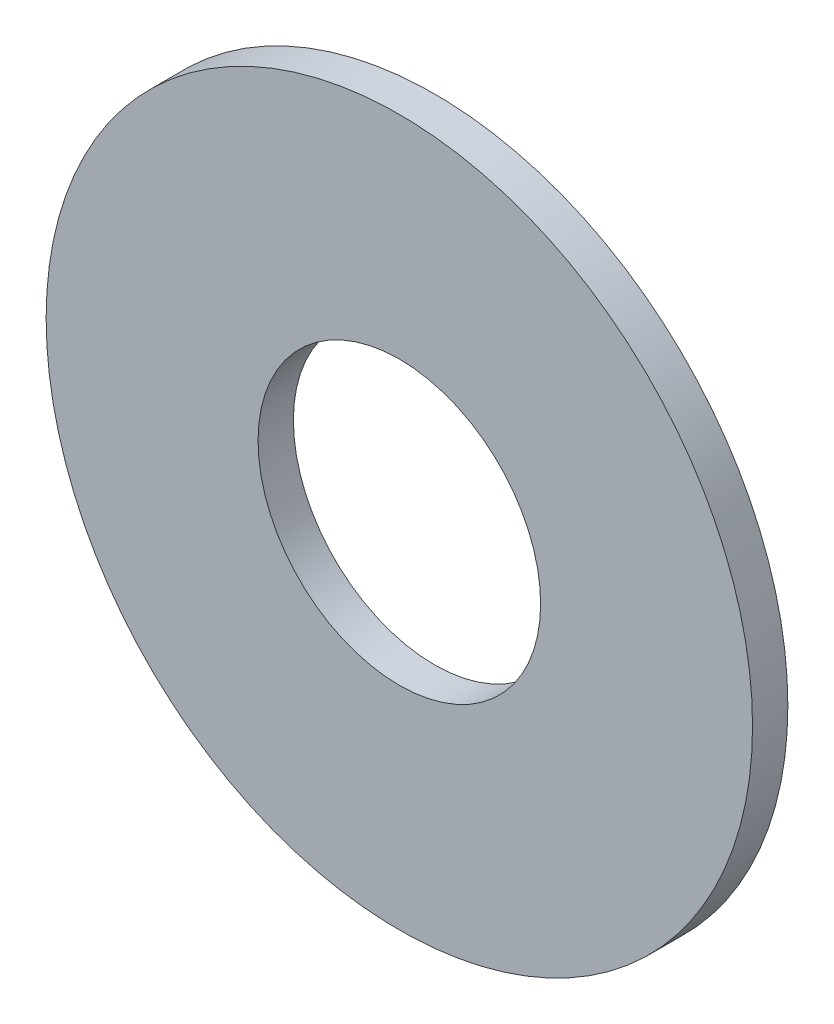
ISO-10303-21;
HEADER;
FILE_DESCRIPTION(('STEP AP214'),'2;1');
FILE_NAME('part.step','',(''),(''),'','','');
FILE_SCHEMA(('AUTOMOTIVE_DESIGN { 1 0 10303 214 1 1 1 1 }'));
ENDSEC;
DATA;
#1=APPLICATION_CONTEXT('core data for automotive mechanical design processes');
#2=APPLICATION_PROTOCOL_DEFINITION('international standard','automotive_design',2000,#1);
#3=PRODUCT_CONTEXT('',#1,'mechanical');
#4=PRODUCT('Part','Part','',(#3));
#5=PRODUCT_RELATED_PRODUCT_CATEGORY('part','',(#4));
#6=PRODUCT_DEFINITION_FORMATION('','',#4);
#7=PRODUCT_DEFINITION_CONTEXT('part definition',#1,'design');
#8=PRODUCT_DEFINITION('design','',#6,#7);
#9=PRODUCT_DEFINITION_SHAPE('','',#8);
#10=(LENGTH_UNIT() NAMED_UNIT(*) SI_UNIT(.MILLI.,.METRE.));
#11=(NAMED_UNIT(*) PLANE_ANGLE_UNIT() SI_UNIT($,.RADIAN.));
#12=(NAMED_UNIT(*) SI_UNIT($,.STERADIAN.) SOLID_ANGLE_UNIT());
#13=UNCERTAINTY_MEASURE_WITH_UNIT(LENGTH_MEASURE(1.E-05),#10,'distance_accuracy_value','');
#14=(GEOMETRIC_REPRESENTATION_CONTEXT(3) GLOBAL_UNCERTAINTY_ASSIGNED_CONTEXT((#13)) GLOBAL_UNIT_ASSIGNED_CONTEXT((#10,
#11,#12)) REPRESENTATION_CONTEXT('',''));
#15=CARTESIAN_POINT('',(0.,0.,0.));
#16=DIRECTION('',(0.,0.,1.));
#17=DIRECTION('',(1.,0.,0.));
#18=AXIS2_PLACEMENT_3D('',#15,#16,#17);
#19=CARTESIAN_POINT('',(0.,0.,0.5));
#20=DIRECTION('',(0.,0.,1.));
#21=DIRECTION('',(1.,0.,0.));
#22=AXIS2_PLACEMENT_3D('',#19,#20,#21);
#23=PLANE('',#22);
#24=CARTESIAN_POINT('',(0.,0.,0.5));
#25=DIRECTION('',(0.,0.,1.));
#26=DIRECTION('',(1.,0.,0.));
#27=AXIS2_PLACEMENT_3D('',#24,#25,#26);
#28=CIRCLE('',#27,5.);
#29=CARTESIAN_POINT('',(5.,0.,0.5));
#30=VERTEX_POINT('',#29);
#31=EDGE_CURVE('E10',#30,#30,#28,.T.);
#32=ORIENTED_EDGE('',*,*,#31,.T.);
#33=EDGE_LOOP('',(#32));
#34=FACE_BOUND('',#33,.T.);
#35=CARTESIAN_POINT('',(0.,0.,0.5));
#36=DIRECTION('',(0.,0.,1.));
#37=DIRECTION('',(1.,0.,0.));
#38=AXIS2_PLACEMENT_3D('',#35,#36,#37);
#39=CIRCLE('',#38,2.);
#40=CARTESIAN_POINT('',(2.,0.,0.5));
#41=VERTEX_POINT('',#40);
#42=EDGE_CURVE('E50',#41,#41,#39,.T.);
#43=ORIENTED_EDGE('',*,*,#42,.F.);
#44=EDGE_LOOP('',(#43));
#45=FACE_BOUND('',#44,.T.);
#46=ADVANCED_FACE('F39',(#34,#45),#23,.T.);
#47=CARTESIAN_POINT('',(0.,0.,0.));
#48=DIRECTION('',(0.,0.,1.));
#49=DIRECTION('',(1.,0.,0.));
#50=AXIS2_PLACEMENT_3D('',#47,#48,#49);
#51=PLANE('',#50);
#52=CARTESIAN_POINT('',(0.,0.,0.));
#53=DIRECTION('',(0.,0.,1.));
#54=DIRECTION('',(1.,0.,0.));
#55=AXIS2_PLACEMENT_3D('',#52,#53,#54);
#56=CIRCLE('',#55,5.);
#57=CARTESIAN_POINT('',(5.,0.,0.));
#58=VERTEX_POINT('',#57);
#59=EDGE_CURVE('E43',#58,#58,#56,.T.);
#60=ORIENTED_EDGE('',*,*,#59,.F.);
#61=EDGE_LOOP('',(#60));
#62=FACE_BOUND('',#61,.T.);
#63=CARTESIAN_POINT('',(0.,0.,0.));
#64=DIRECTION('',(0.,0.,1.));
#65=DIRECTION('',(1.,0.,0.));
#66=AXIS2_PLACEMENT_3D('',#63,#64,#65);
#67=CIRCLE('',#66,2.);
#68=CARTESIAN_POINT('',(2.,0.,0.));
#69=VERTEX_POINT('',#68);
#70=EDGE_CURVE('E52',#69,#69,#67,.T.);
#71=ORIENTED_EDGE('',*,*,#70,.T.);
#72=EDGE_LOOP('',(#71));
#73=FACE_BOUND('',#72,.T.);
#74=ADVANCED_FACE('F62',(#62,#73),#51,.F.);
#75=CARTESIAN_POINT('',(0.,0.,0.5));
#76=DIRECTION('',(0.,0.,-1.));
#77=DIRECTION('',(-1.,0.,0.));
#78=AXIS2_PLACEMENT_3D('',#75,#76,#77);
#79=CYLINDRICAL_SURFACE('',#78,5.);
#80=ORIENTED_EDGE('',*,*,#31,.F.);
#81=EDGE_LOOP('',(#80));
#82=FACE_BOUND('',#81,.T.);
#83=ORIENTED_EDGE('',*,*,#59,.T.);
#84=EDGE_LOOP('',(#83));
#85=FACE_BOUND('',#84,.T.);
#86=ADVANCED_FACE('F41',(#82,#85),#79,.T.);
#87=CARTESIAN_POINT('',(0.,0.,0.5));
#88=DIRECTION('',(0.,0.,-1.));
#89=DIRECTION('',(-1.,0.,0.));
#90=AXIS2_PLACEMENT_3D('',#87,#88,#89);
#91=CYLINDRICAL_SURFACE('',#90,2.);
#92=ORIENTED_EDGE('',*,*,#42,.T.);
#93=EDGE_LOOP('',(#92));
#94=FACE_BOUND('',#93,.T.);
#95=ORIENTED_EDGE('',*,*,#70,.F.);
#96=EDGE_LOOP('',(#95));
#97=FACE_BOUND('',#96,.T.);
#98=ADVANCED_FACE('F58',(#94,#97),#91,.F.);
#99=CLOSED_SHELL('',(#46,#74,#86,#98));
#100=MANIFOLD_SOLID_BREP('B2',#99);
#101=ADVANCED_BREP_SHAPE_REPRESENTATION('',(#18,#100),#14);
#102=SHAPE_DEFINITION_REPRESENTATION(#9,#101);
ENDSEC;
END-ISO-10303-21;
